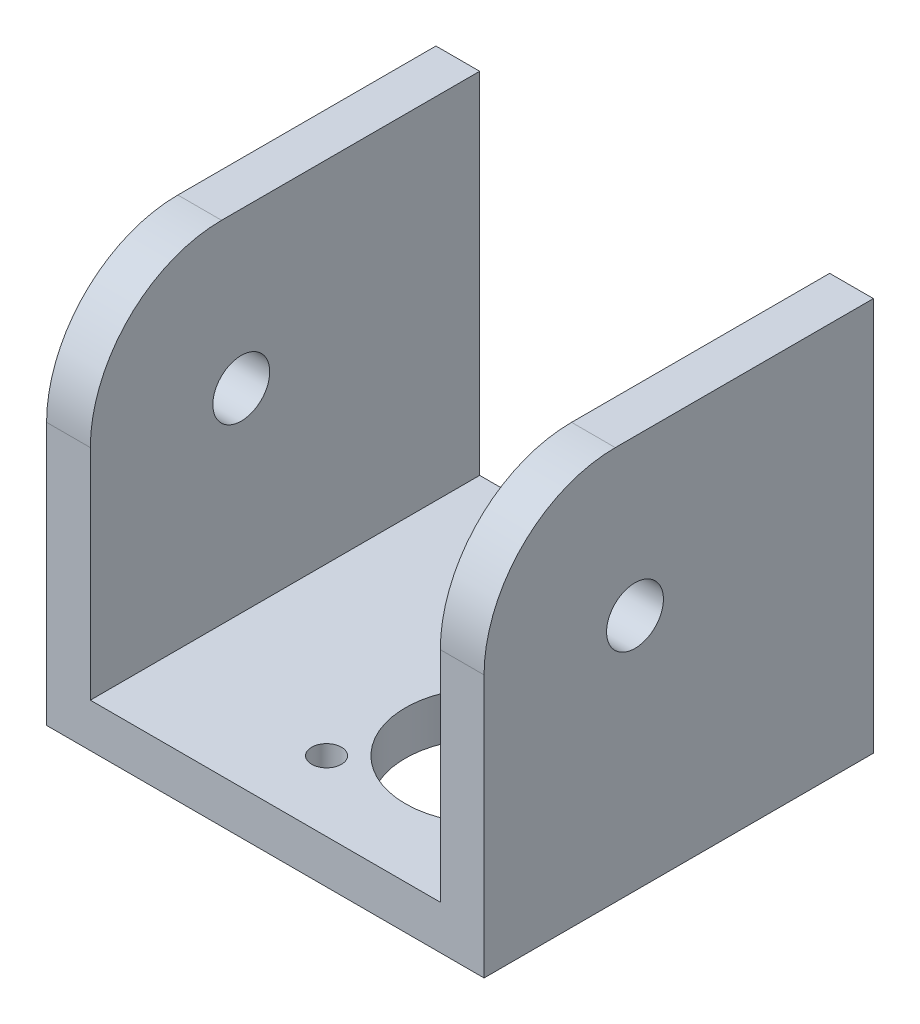
ISO-10303-21;
HEADER;
FILE_DESCRIPTION(('STEP AP214'),'2;1');
FILE_NAME('part.step','',(''),(''),'','','');
FILE_SCHEMA(('AUTOMOTIVE_DESIGN { 1 0 10303 214 1 1 1 1 }'));
ENDSEC;
DATA;
#1=APPLICATION_CONTEXT('core data for automotive mechanical design processes');
#2=APPLICATION_PROTOCOL_DEFINITION('international standard','automotive_design',2000,#1);
#3=PRODUCT_CONTEXT('',#1,'mechanical');
#4=PRODUCT('Part','Part','',(#3));
#5=PRODUCT_RELATED_PRODUCT_CATEGORY('part','',(#4));
#6=PRODUCT_DEFINITION_FORMATION('','',#4);
#7=PRODUCT_DEFINITION_CONTEXT('part definition',#1,'design');
#8=PRODUCT_DEFINITION('design','',#6,#7);
#9=PRODUCT_DEFINITION_SHAPE('','',#8);
#10=(LENGTH_UNIT() NAMED_UNIT(*) SI_UNIT(.MILLI.,.METRE.));
#11=(NAMED_UNIT(*) PLANE_ANGLE_UNIT() SI_UNIT($,.RADIAN.));
#12=(NAMED_UNIT(*) SI_UNIT($,.STERADIAN.) SOLID_ANGLE_UNIT());
#13=UNCERTAINTY_MEASURE_WITH_UNIT(LENGTH_MEASURE(1.E-05),#10,'distance_accuracy_value','');
#14=(GEOMETRIC_REPRESENTATION_CONTEXT(3) GLOBAL_UNCERTAINTY_ASSIGNED_CONTEXT((#13)) GLOBAL_UNIT_ASSIGNED_CONTEXT((#10,
#11,#12)) REPRESENTATION_CONTEXT('',''));
#15=CARTESIAN_POINT('',(0.,0.,0.));
#16=DIRECTION('',(0.,0.,1.));
#17=DIRECTION('',(1.,0.,0.));
#18=AXIS2_PLACEMENT_3D('',#15,#16,#17);
#19=CARTESIAN_POINT('',(5.,5.,-56.5685424949238));
#20=DIRECTION('',(0.,-1.,0.));
#21=DIRECTION('',(0.,0.,-1.));
#22=AXIS2_PLACEMENT_3D('',#19,#20,#21);
#23=PLANE('',#22);
#24=CARTESIAN_POINT('',(42.5,5.,18.));
#25=DIRECTION('',(0.,1.,0.));
#26=DIRECTION('',(0.,0.,1.));
#27=AXIS2_PLACEMENT_3D('',#24,#25,#26);
#28=CIRCLE('',#27,1.7);
#29=CARTESIAN_POINT('',(42.5,5.,19.7));
#30=VERTEX_POINT('',#29);
#31=EDGE_CURVE('E400',#30,#30,#28,.T.);
#32=ORIENTED_EDGE('',*,*,#31,.F.);
#33=EDGE_LOOP('',(#32));
#34=FACE_BOUND('',#33,.T.);
#35=CARTESIAN_POINT('',(24.,5.,18.));
#36=DIRECTION('',(0.,1.,0.));
#37=DIRECTION('',(0.,0.,1.));
#38=AXIS2_PLACEMENT_3D('',#35,#36,#37);
#39=CIRCLE('',#38,1.7);
#40=CARTESIAN_POINT('',(24.,5.,19.7));
#41=VERTEX_POINT('',#40);
#42=EDGE_CURVE('E412',#41,#41,#39,.T.);
#43=ORIENTED_EDGE('',*,*,#42,.F.);
#44=EDGE_LOOP('',(#43));
#45=FACE_BOUND('',#44,.T.);
#46=DIRECTION('',(0.,0.,1.));
#47=VECTOR('',#46,1.);
#48=CARTESIAN_POINT('',(5.,5.,-56.5685424949238));
#49=LINE('',#48,#47);
#50=CARTESIAN_POINT('',(5.,5.,0.));
#51=VERTEX_POINT('',#50);
#52=CARTESIAN_POINT('',(5.,5.,44.5));
#53=VERTEX_POINT('',#52);
#54=EDGE_CURVE('E144',#51,#53,#49,.T.);
#55=ORIENTED_EDGE('',*,*,#54,.T.);
#56=DIRECTION('',(1.,0.,0.));
#57=VECTOR('',#56,1.);
#58=CARTESIAN_POINT('',(5.,5.,44.5));
#59=LINE('',#58,#57);
#60=CARTESIAN_POINT('',(45.,5.,44.5));
#61=VERTEX_POINT('',#60);
#62=EDGE_CURVE('E131',#53,#61,#59,.T.);
#63=ORIENTED_EDGE('',*,*,#62,.T.);
#64=DIRECTION('',(0.,0.,1.));
#65=VECTOR('',#64,1.);
#66=CARTESIAN_POINT('',(45.,5.,-56.5685424949238));
#67=LINE('',#66,#65);
#68=CARTESIAN_POINT('',(45.,5.,0.));
#69=VERTEX_POINT('',#68);
#70=EDGE_CURVE('E116',#69,#61,#67,.T.);
#71=ORIENTED_EDGE('',*,*,#70,.F.);
#72=DIRECTION('',(1.,0.,0.));
#73=VECTOR('',#72,1.);
#74=CARTESIAN_POINT('',(5.,5.,0.));
#75=LINE('',#74,#73);
#76=EDGE_CURVE('E128',#51,#69,#75,.T.);
#77=ORIENTED_EDGE('',*,*,#76,.F.);
#78=EDGE_LOOP('',(#55,#63,#71,#77));
#79=FACE_BOUND('',#78,.T.);
#80=CARTESIAN_POINT('',(33.25,5.,27.25));
#81=DIRECTION('',(0.,1.,0.));
#82=DIRECTION('',(0.,0.,1.));
#83=AXIS2_PLACEMENT_3D('',#80,#81,#82);
#84=CIRCLE('',#83,9.5);
#85=CARTESIAN_POINT('',(33.25,5.,36.75));
#86=VERTEX_POINT('',#85);
#87=EDGE_CURVE('E430',#86,#86,#84,.T.);
#88=ORIENTED_EDGE('',*,*,#87,.F.);
#89=EDGE_LOOP('',(#88));
#90=FACE_BOUND('',#89,.T.);
#91=CARTESIAN_POINT('',(42.5,5.,36.5));
#92=DIRECTION('',(0.,1.,0.));
#93=DIRECTION('',(0.,0.,1.));
#94=AXIS2_PLACEMENT_3D('',#91,#92,#93);
#95=CIRCLE('',#94,1.7);
#96=CARTESIAN_POINT('',(42.5,5.,38.2));
#97=VERTEX_POINT('',#96);
#98=EDGE_CURVE('E424',#97,#97,#95,.T.);
#99=ORIENTED_EDGE('',*,*,#98,.F.);
#100=EDGE_LOOP('',(#99));
#101=FACE_BOUND('',#100,.T.);
#102=CARTESIAN_POINT('',(24.,5.,36.5));
#103=DIRECTION('',(0.,1.,0.));
#104=DIRECTION('',(0.,0.,1.));
#105=AXIS2_PLACEMENT_3D('',#102,#103,#104);
#106=CIRCLE('',#105,1.7);
#107=CARTESIAN_POINT('',(24.,5.,38.2));
#108=VERTEX_POINT('',#107);
#109=EDGE_CURVE('E418',#108,#108,#106,.T.);
#110=ORIENTED_EDGE('',*,*,#109,.F.);
#111=EDGE_LOOP('',(#110));
#112=FACE_BOUND('',#111,.T.);
#113=ADVANCED_FACE('F39',(#34,#45,#79,#90,#101,#112),#23,.F.);
#114=CARTESIAN_POINT('',(0.,45.,44.5));
#115=DIRECTION('',(0.,-1.,0.));
#116=DIRECTION('',(0.,0.,-1.));
#117=AXIS2_PLACEMENT_3D('',#114,#115,#116);
#118=PLANE('',#117);
#119=DIRECTION('',(0.,0.,1.));
#120=VECTOR('',#119,1.);
#121=CARTESIAN_POINT('',(45.,45.,-56.5685424949238));
#122=LINE('',#121,#120);
#123=CARTESIAN_POINT('',(45.,45.,0.));
#124=VERTEX_POINT('',#123);
#125=CARTESIAN_POINT('',(45.,45.,29.5));
#126=VERTEX_POINT('',#125);
#127=EDGE_CURVE('E118',#124,#126,#122,.T.);
#128=ORIENTED_EDGE('',*,*,#127,.T.);
#129=DIRECTION('',(-1.,0.,0.));
#130=VECTOR('',#129,1.);
#131=CARTESIAN_POINT('',(0.,45.,29.5));
#132=LINE('',#131,#130);
#133=CARTESIAN_POINT('',(50.,45.,29.5));
#134=VERTEX_POINT('',#133);
#135=EDGE_CURVE('E48',#126,#134,#132,.F.);
#136=ORIENTED_EDGE('',*,*,#135,.T.);
#137=DIRECTION('',(0.,0.,-1.));
#138=VECTOR('',#137,1.);
#139=CARTESIAN_POINT('',(50.,45.,44.5));
#140=LINE('',#139,#138);
#141=CARTESIAN_POINT('',(50.,45.,0.));
#142=VERTEX_POINT('',#141);
#143=EDGE_CURVE('E171',#134,#142,#140,.T.);
#144=ORIENTED_EDGE('',*,*,#143,.T.);
#145=DIRECTION('',(-1.,0.,0.));
#146=VECTOR('',#145,1.);
#147=CARTESIAN_POINT('',(0.,45.,0.));
#148=LINE('',#147,#146);
#149=EDGE_CURVE('E155',#142,#124,#148,.T.);
#150=ORIENTED_EDGE('',*,*,#149,.T.);
#151=EDGE_LOOP('',(#128,#136,#144,#150));
#152=FACE_BOUND('',#151,.T.);
#153=ADVANCED_FACE('F224',(#152),#118,.F.);
#154=CARTESIAN_POINT('',(0.,0.,44.5));
#155=DIRECTION('',(1.,0.,0.));
#156=DIRECTION('',(0.,0.,-1.));
#157=AXIS2_PLACEMENT_3D('',#154,#155,#156);
#158=PLANE('',#157);
#159=CARTESIAN_POINT('',(0.,27.25,27.25));
#160=DIRECTION('',(1.,0.,0.));
#161=DIRECTION('',(0.,0.,-1.));
#162=AXIS2_PLACEMENT_3D('',#159,#160,#161);
#163=CIRCLE('',#162,3.25);
#164=CARTESIAN_POINT('',(0.,27.25,24.));
#165=VERTEX_POINT('',#164);
#166=EDGE_CURVE('E406',#165,#165,#163,.F.);
#167=ORIENTED_EDGE('',*,*,#166,.F.);
#168=EDGE_LOOP('',(#167));
#169=FACE_BOUND('',#168,.T.);
#170=DIRECTION('',(0.,-1.,0.));
#171=VECTOR('',#170,1.);
#172=CARTESIAN_POINT('',(0.,0.,44.5));
#173=LINE('',#172,#171);
#174=CARTESIAN_POINT('',(0.,30.,44.5));
#175=VERTEX_POINT('',#174);
#176=CARTESIAN_POINT('',(0.,0.,44.5));
#177=VERTEX_POINT('',#176);
#178=EDGE_CURVE('E152',#175,#177,#173,.T.);
#179=ORIENTED_EDGE('',*,*,#178,.F.);
#180=CARTESIAN_POINT('',(0.,30.,29.5));
#181=DIRECTION('',(1.,0.,0.));
#182=DIRECTION('',(0.,0.,-1.));
#183=AXIS2_PLACEMENT_3D('',#180,#181,#182);
#184=CIRCLE('',#183,15.);
#185=CARTESIAN_POINT('',(0.,45.,29.5));
#186=VERTEX_POINT('',#185);
#187=EDGE_CURVE('E185',#175,#186,#184,.F.);
#188=ORIENTED_EDGE('',*,*,#187,.T.);
#189=DIRECTION('',(0.,0.,-1.));
#190=VECTOR('',#189,1.);
#191=CARTESIAN_POINT('',(0.,45.,44.5));
#192=LINE('',#191,#190);
#193=CARTESIAN_POINT('',(0.,45.,0.));
#194=VERTEX_POINT('',#193);
#195=EDGE_CURVE('E160',#186,#194,#192,.T.);
#196=ORIENTED_EDGE('',*,*,#195,.T.);
#197=DIRECTION('',(0.,-1.,0.));
#198=VECTOR('',#197,1.);
#199=CARTESIAN_POINT('',(0.,0.,0.));
#200=LINE('',#199,#198);
#201=CARTESIAN_POINT('',(0.,0.,0.));
#202=VERTEX_POINT('',#201);
#203=EDGE_CURVE('E151',#194,#202,#200,.T.);
#204=ORIENTED_EDGE('',*,*,#203,.T.);
#205=DIRECTION('',(0.,0.,-1.));
#206=VECTOR('',#205,1.);
#207=CARTESIAN_POINT('',(0.,0.,44.5));
#208=LINE('',#207,#206);
#209=EDGE_CURVE('E176',#177,#202,#208,.T.);
#210=ORIENTED_EDGE('',*,*,#209,.F.);
#211=EDGE_LOOP('',(#179,#188,#196,#204,#210));
#212=FACE_BOUND('',#211,.T.);
#213=ADVANCED_FACE('F207',(#169,#212),#158,.F.);
#214=CARTESIAN_POINT('',(0.,0.,44.5));
#215=DIRECTION('',(0.,1.,0.));
#216=DIRECTION('',(0.,0.,1.));
#217=AXIS2_PLACEMENT_3D('',#214,#215,#216);
#218=PLANE('',#217);
#219=CARTESIAN_POINT('',(42.5,0.,18.));
#220=DIRECTION('',(0.,1.,0.));
#221=DIRECTION('',(0.,0.,1.));
#222=AXIS2_PLACEMENT_3D('',#219,#220,#221);
#223=CIRCLE('',#222,1.7);
#224=CARTESIAN_POINT('',(42.5,0.,19.7));
#225=VERTEX_POINT('',#224);
#226=EDGE_CURVE('E403',#225,#225,#223,.T.);
#227=ORIENTED_EDGE('',*,*,#226,.T.);
#228=EDGE_LOOP('',(#227));
#229=FACE_BOUND('',#228,.T.);
#230=CARTESIAN_POINT('',(24.,0.,18.));
#231=DIRECTION('',(0.,1.,0.));
#232=DIRECTION('',(0.,0.,1.));
#233=AXIS2_PLACEMENT_3D('',#230,#231,#232);
#234=CIRCLE('',#233,1.7);
#235=CARTESIAN_POINT('',(24.,0.,19.7));
#236=VERTEX_POINT('',#235);
#237=EDGE_CURVE('E415',#236,#236,#234,.T.);
#238=ORIENTED_EDGE('',*,*,#237,.T.);
#239=EDGE_LOOP('',(#238));
#240=FACE_BOUND('',#239,.T.);
#241=CARTESIAN_POINT('',(24.,0.,36.5));
#242=DIRECTION('',(0.,1.,0.));
#243=DIRECTION('',(0.,0.,1.));
#244=AXIS2_PLACEMENT_3D('',#241,#242,#243);
#245=CIRCLE('',#244,1.7);
#246=CARTESIAN_POINT('',(24.,0.,38.2));
#247=VERTEX_POINT('',#246);
#248=EDGE_CURVE('E421',#247,#247,#245,.T.);
#249=ORIENTED_EDGE('',*,*,#248,.T.);
#250=EDGE_LOOP('',(#249));
#251=FACE_BOUND('',#250,.T.);
#252=CARTESIAN_POINT('',(42.5,0.,36.5));
#253=DIRECTION('',(0.,1.,0.));
#254=DIRECTION('',(0.,0.,1.));
#255=AXIS2_PLACEMENT_3D('',#252,#253,#254);
#256=CIRCLE('',#255,1.7);
#257=CARTESIAN_POINT('',(42.5,0.,38.2));
#258=VERTEX_POINT('',#257);
#259=EDGE_CURVE('E427',#258,#258,#256,.T.);
#260=ORIENTED_EDGE('',*,*,#259,.T.);
#261=EDGE_LOOP('',(#260));
#262=FACE_BOUND('',#261,.T.);
#263=CARTESIAN_POINT('',(33.25,0.,27.25));
#264=DIRECTION('',(0.,1.,0.));
#265=DIRECTION('',(0.,0.,1.));
#266=AXIS2_PLACEMENT_3D('',#263,#264,#265);
#267=CIRCLE('',#266,9.5);
#268=CARTESIAN_POINT('',(33.25,0.,36.75));
#269=VERTEX_POINT('',#268);
#270=EDGE_CURVE('E203',#269,#269,#267,.F.);
#271=ORIENTED_EDGE('',*,*,#270,.F.);
#272=EDGE_LOOP('',(#271));
#273=FACE_BOUND('',#272,.T.);
#274=DIRECTION('',(1.,0.,0.));
#275=VECTOR('',#274,1.);
#276=CARTESIAN_POINT('',(0.,0.,0.));
#277=LINE('',#276,#275);
#278=CARTESIAN_POINT('',(50.,0.,0.));
#279=VERTEX_POINT('',#278);
#280=EDGE_CURVE('E163',#202,#279,#277,.T.);
#281=ORIENTED_EDGE('',*,*,#280,.T.);
#282=DIRECTION('',(0.,0.,-1.));
#283=VECTOR('',#282,1.);
#284=CARTESIAN_POINT('',(50.,0.,44.5));
#285=LINE('',#284,#283);
#286=CARTESIAN_POINT('',(50.,0.,44.5));
#287=VERTEX_POINT('',#286);
#288=EDGE_CURVE('E173',#287,#279,#285,.T.);
#289=ORIENTED_EDGE('',*,*,#288,.F.);
#290=DIRECTION('',(1.,0.,0.));
#291=VECTOR('',#290,1.);
#292=CARTESIAN_POINT('',(0.,0.,44.5));
#293=LINE('',#292,#291);
#294=EDGE_CURVE('E154',#177,#287,#293,.T.);
#295=ORIENTED_EDGE('',*,*,#294,.F.);
#296=ORIENTED_EDGE('',*,*,#209,.T.);
#297=EDGE_LOOP('',(#281,#289,#295,#296));
#298=FACE_BOUND('',#297,.T.);
#299=ADVANCED_FACE('F216',(#229,#240,#251,#262,#273,#298),#218,.F.);
#300=CARTESIAN_POINT('',(50.,0.,44.5));
#301=DIRECTION('',(-1.,0.,0.));
#302=DIRECTION('',(0.,0.,1.));
#303=AXIS2_PLACEMENT_3D('',#300,#301,#302);
#304=PLANE('',#303);
#305=CARTESIAN_POINT('',(50.,27.25,27.25));
#306=DIRECTION('',(1.,0.,0.));
#307=DIRECTION('',(0.,0.,-1.));
#308=AXIS2_PLACEMENT_3D('',#305,#306,#307);
#309=CIRCLE('',#308,3.25);
#310=CARTESIAN_POINT('',(50.,27.25,24.));
#311=VERTEX_POINT('',#310);
#312=EDGE_CURVE('E396',#311,#311,#309,.T.);
#313=ORIENTED_EDGE('',*,*,#312,.F.);
#314=EDGE_LOOP('',(#313));
#315=FACE_BOUND('',#314,.T.);
#316=ORIENTED_EDGE('',*,*,#143,.F.);
#317=CARTESIAN_POINT('',(50.,30.,29.5));
#318=DIRECTION('',(-1.,0.,0.));
#319=DIRECTION('',(0.,0.,1.));
#320=AXIS2_PLACEMENT_3D('',#317,#318,#319);
#321=CIRCLE('',#320,15.);
#322=CARTESIAN_POINT('',(50.,30.,44.5));
#323=VERTEX_POINT('',#322);
#324=EDGE_CURVE('E11',#134,#323,#321,.F.);
#325=ORIENTED_EDGE('',*,*,#324,.T.);
#326=DIRECTION('',(0.,1.,0.));
#327=VECTOR('',#326,1.);
#328=CARTESIAN_POINT('',(50.,0.,44.5));
#329=LINE('',#328,#327);
#330=EDGE_CURVE('E157',#287,#323,#329,.T.);
#331=ORIENTED_EDGE('',*,*,#330,.F.);
#332=ORIENTED_EDGE('',*,*,#288,.T.);
#333=DIRECTION('',(0.,1.,0.));
#334=VECTOR('',#333,1.);
#335=CARTESIAN_POINT('',(50.,0.,0.));
#336=LINE('',#335,#334);
#337=EDGE_CURVE('E165',#279,#142,#336,.T.);
#338=ORIENTED_EDGE('',*,*,#337,.T.);
#339=EDGE_LOOP('',(#316,#325,#331,#332,#338));
#340=FACE_BOUND('',#339,.T.);
#341=ADVANCED_FACE('F223',(#315,#340),#304,.F.);
#342=ORIENTED_EDGE('',*,*,#195,.F.);
#343=DIRECTION('',(-1.,0.,0.));
#344=VECTOR('',#343,1.);
#345=CARTESIAN_POINT('',(0.,45.,29.5));
#346=LINE('',#345,#344);
#347=CARTESIAN_POINT('',(5.,45.,29.5));
#348=VERTEX_POINT('',#347);
#349=EDGE_CURVE('E187',#186,#348,#346,.F.);
#350=ORIENTED_EDGE('',*,*,#349,.T.);
#351=DIRECTION('',(0.,0.,1.));
#352=VECTOR('',#351,1.);
#353=CARTESIAN_POINT('',(5.,45.,-56.5685424949238));
#354=LINE('',#353,#352);
#355=CARTESIAN_POINT('',(5.,45.,0.));
#356=VERTEX_POINT('',#355);
#357=EDGE_CURVE('E145',#356,#348,#354,.T.);
#358=ORIENTED_EDGE('',*,*,#357,.F.);
#359=EDGE_CURVE('E168',#356,#194,#148,.T.);
#360=ORIENTED_EDGE('',*,*,#359,.T.);
#361=EDGE_LOOP('',(#342,#350,#358,#360));
#362=FACE_BOUND('',#361,.T.);
#363=ADVANCED_FACE('F211',(#362),#118,.F.);
#364=CARTESIAN_POINT('',(0.,0.,44.5));
#365=DIRECTION('',(0.,0.,-1.));
#366=DIRECTION('',(-1.,0.,0.));
#367=AXIS2_PLACEMENT_3D('',#364,#365,#366);
#368=PLANE('',#367);
#369=DIRECTION('',(0.,-1.,0.));
#370=VECTOR('',#369,1.);
#371=CARTESIAN_POINT('',(5.,45.,44.5));
#372=LINE('',#371,#370);
#373=CARTESIAN_POINT('',(5.,30.,44.5));
#374=VERTEX_POINT('',#373);
#375=EDGE_CURVE('E142',#374,#53,#372,.T.);
#376=ORIENTED_EDGE('',*,*,#375,.F.);
#377=DIRECTION('',(-1.,0.,0.));
#378=VECTOR('',#377,1.);
#379=CARTESIAN_POINT('',(0.,30.,44.5));
#380=LINE('',#379,#378);
#381=EDGE_CURVE('E182',#374,#175,#380,.T.);
#382=ORIENTED_EDGE('',*,*,#381,.T.);
#383=ORIENTED_EDGE('',*,*,#178,.T.);
#384=ORIENTED_EDGE('',*,*,#294,.T.);
#385=ORIENTED_EDGE('',*,*,#330,.T.);
#386=DIRECTION('',(-1.,0.,0.));
#387=VECTOR('',#386,1.);
#388=CARTESIAN_POINT('',(0.,30.,44.5));
#389=LINE('',#388,#387);
#390=CARTESIAN_POINT('',(45.,30.,44.5));
#391=VERTEX_POINT('',#390);
#392=EDGE_CURVE('E179',#323,#391,#389,.T.);
#393=ORIENTED_EDGE('',*,*,#392,.T.);
#394=DIRECTION('',(0.,1.,0.));
#395=VECTOR('',#394,1.);
#396=CARTESIAN_POINT('',(45.,5.,44.5));
#397=LINE('',#396,#395);
#398=EDGE_CURVE('E137',#61,#391,#397,.T.);
#399=ORIENTED_EDGE('',*,*,#398,.F.);
#400=ORIENTED_EDGE('',*,*,#62,.F.);
#401=EDGE_LOOP('',(#376,#382,#383,#384,#385,#393,#399,#400));
#402=FACE_BOUND('',#401,.T.);
#403=ADVANCED_FACE('F201',(#402),#368,.F.);
#404=CARTESIAN_POINT('',(0.,0.,0.));
#405=DIRECTION('',(0.,0.,-1.));
#406=DIRECTION('',(-1.,0.,0.));
#407=AXIS2_PLACEMENT_3D('',#404,#405,#406);
#408=PLANE('',#407);
#409=DIRECTION('',(0.,1.,0.));
#410=VECTOR('',#409,1.);
#411=CARTESIAN_POINT('',(45.,5.,0.));
#412=LINE('',#411,#410);
#413=EDGE_CURVE('E113',#69,#124,#412,.T.);
#414=ORIENTED_EDGE('',*,*,#413,.T.);
#415=ORIENTED_EDGE('',*,*,#149,.F.);
#416=ORIENTED_EDGE('',*,*,#337,.F.);
#417=ORIENTED_EDGE('',*,*,#280,.F.);
#418=ORIENTED_EDGE('',*,*,#203,.F.);
#419=ORIENTED_EDGE('',*,*,#359,.F.);
#420=DIRECTION('',(0.,-1.,0.));
#421=VECTOR('',#420,1.);
#422=CARTESIAN_POINT('',(5.,45.,0.));
#423=LINE('',#422,#421);
#424=EDGE_CURVE('E136',#356,#51,#423,.T.);
#425=ORIENTED_EDGE('',*,*,#424,.T.);
#426=ORIENTED_EDGE('',*,*,#76,.T.);
#427=EDGE_LOOP('',(#414,#415,#416,#417,#418,#419,#425,#426));
#428=FACE_BOUND('',#427,.T.);
#429=ADVANCED_FACE('F134',(#428),#408,.T.);
#430=CARTESIAN_POINT('',(45.,5.,-56.5685424949238));
#431=DIRECTION('',(1.,0.,0.));
#432=DIRECTION('',(0.,0.,-1.));
#433=AXIS2_PLACEMENT_3D('',#430,#431,#432);
#434=PLANE('',#433);
#435=CARTESIAN_POINT('',(45.,27.25,27.25));
#436=DIRECTION('',(1.,0.,0.));
#437=DIRECTION('',(0.,0.,-1.));
#438=AXIS2_PLACEMENT_3D('',#435,#436,#437);
#439=CIRCLE('',#438,3.25);
#440=CARTESIAN_POINT('',(45.,27.25,24.));
#441=VERTEX_POINT('',#440);
#442=EDGE_CURVE('E399',#441,#441,#439,.T.);
#443=ORIENTED_EDGE('',*,*,#442,.T.);
#444=EDGE_LOOP('',(#443));
#445=FACE_BOUND('',#444,.T.);
#446=ORIENTED_EDGE('',*,*,#398,.T.);
#447=CARTESIAN_POINT('',(45.,30.,29.5));
#448=DIRECTION('',(1.,0.,0.));
#449=DIRECTION('',(0.,0.,-1.));
#450=AXIS2_PLACEMENT_3D('',#447,#448,#449);
#451=CIRCLE('',#450,15.);
#452=EDGE_CURVE('E62',#391,#126,#451,.F.);
#453=ORIENTED_EDGE('',*,*,#452,.T.);
#454=ORIENTED_EDGE('',*,*,#127,.F.);
#455=ORIENTED_EDGE('',*,*,#413,.F.);
#456=ORIENTED_EDGE('',*,*,#70,.T.);
#457=EDGE_LOOP('',(#446,#453,#454,#455,#456));
#458=FACE_BOUND('',#457,.T.);
#459=ADVANCED_FACE('F115',(#445,#458),#434,.F.);
#460=CARTESIAN_POINT('',(5.,45.,-56.5685424949238));
#461=DIRECTION('',(-1.,0.,0.));
#462=DIRECTION('',(0.,-1.,0.));
#463=AXIS2_PLACEMENT_3D('',#460,#461,#462);
#464=PLANE('',#463);
#465=CARTESIAN_POINT('',(5.,27.25,27.25));
#466=DIRECTION('',(-1.,0.,0.));
#467=DIRECTION('',(0.,-1.,0.));
#468=AXIS2_PLACEMENT_3D('',#465,#466,#467);
#469=CIRCLE('',#468,3.25);
#470=CARTESIAN_POINT('',(5.,24.,27.25));
#471=VERTEX_POINT('',#470);
#472=EDGE_CURVE('E43',#471,#471,#469,.T.);
#473=ORIENTED_EDGE('',*,*,#472,.T.);
#474=EDGE_LOOP('',(#473));
#475=FACE_BOUND('',#474,.T.);
#476=ORIENTED_EDGE('',*,*,#357,.T.);
#477=CARTESIAN_POINT('',(5.,30.,29.5));
#478=DIRECTION('',(-1.,0.,0.));
#479=DIRECTION('',(0.,-1.,0.));
#480=AXIS2_PLACEMENT_3D('',#477,#478,#479);
#481=CIRCLE('',#480,15.);
#482=EDGE_CURVE('E189',#348,#374,#481,.F.);
#483=ORIENTED_EDGE('',*,*,#482,.T.);
#484=ORIENTED_EDGE('',*,*,#375,.T.);
#485=ORIENTED_EDGE('',*,*,#54,.F.);
#486=ORIENTED_EDGE('',*,*,#424,.F.);
#487=EDGE_LOOP('',(#476,#483,#484,#485,#486));
#488=FACE_BOUND('',#487,.T.);
#489=ADVANCED_FACE('F195',(#475,#488),#464,.F.);
#490=CARTESIAN_POINT('',(33.25,-26.8700576850888,27.25));
#491=DIRECTION('',(0.,1.,0.));
#492=DIRECTION('',(0.,0.,1.));
#493=AXIS2_PLACEMENT_3D('',#490,#491,#492);
#494=CYLINDRICAL_SURFACE('',#493,9.5);
#495=ORIENTED_EDGE('',*,*,#270,.T.);
#496=EDGE_LOOP('',(#495));
#497=FACE_BOUND('',#496,.T.);
#498=ORIENTED_EDGE('',*,*,#87,.T.);
#499=EDGE_LOOP('',(#498));
#500=FACE_BOUND('',#499,.T.);
#501=ADVANCED_FACE('F277',(#497,#500),#494,.F.);
#502=CARTESIAN_POINT('',(42.5,5.,36.5));
#503=DIRECTION('',(0.,1.,0.));
#504=DIRECTION('',(0.,0.,1.));
#505=AXIS2_PLACEMENT_3D('',#502,#503,#504);
#506=CYLINDRICAL_SURFACE('',#505,1.7);
#507=ORIENTED_EDGE('',*,*,#259,.F.);
#508=EDGE_LOOP('',(#507));
#509=FACE_BOUND('',#508,.T.);
#510=ORIENTED_EDGE('',*,*,#98,.T.);
#511=EDGE_LOOP('',(#510));
#512=FACE_BOUND('',#511,.T.);
#513=ADVANCED_FACE('F273',(#509,#512),#506,.F.);
#514=CARTESIAN_POINT('',(24.,5.,36.5));
#515=DIRECTION('',(0.,1.,0.));
#516=DIRECTION('',(0.,0.,1.));
#517=AXIS2_PLACEMENT_3D('',#514,#515,#516);
#518=CYLINDRICAL_SURFACE('',#517,1.7);
#519=ORIENTED_EDGE('',*,*,#248,.F.);
#520=EDGE_LOOP('',(#519));
#521=FACE_BOUND('',#520,.T.);
#522=ORIENTED_EDGE('',*,*,#109,.T.);
#523=EDGE_LOOP('',(#522));
#524=FACE_BOUND('',#523,.T.);
#525=ADVANCED_FACE('F263',(#521,#524),#518,.F.);
#526=CARTESIAN_POINT('',(24.,5.,18.));
#527=DIRECTION('',(0.,1.,0.));
#528=DIRECTION('',(0.,0.,1.));
#529=AXIS2_PLACEMENT_3D('',#526,#527,#528);
#530=CYLINDRICAL_SURFACE('',#529,1.7);
#531=ORIENTED_EDGE('',*,*,#237,.F.);
#532=EDGE_LOOP('',(#531));
#533=FACE_BOUND('',#532,.T.);
#534=ORIENTED_EDGE('',*,*,#42,.T.);
#535=EDGE_LOOP('',(#534));
#536=FACE_BOUND('',#535,.T.);
#537=ADVANCED_FACE('F257',(#533,#536),#530,.F.);
#538=CARTESIAN_POINT('',(42.5,5.,18.));
#539=DIRECTION('',(0.,1.,0.));
#540=DIRECTION('',(0.,0.,1.));
#541=AXIS2_PLACEMENT_3D('',#538,#539,#540);
#542=CYLINDRICAL_SURFACE('',#541,1.7);
#543=ORIENTED_EDGE('',*,*,#226,.F.);
#544=EDGE_LOOP('',(#543));
#545=FACE_BOUND('',#544,.T.);
#546=ORIENTED_EDGE('',*,*,#31,.T.);
#547=EDGE_LOOP('',(#546));
#548=FACE_BOUND('',#547,.T.);
#549=ADVANCED_FACE('F251',(#545,#548),#542,.F.);
#550=CARTESIAN_POINT('',(0.,30.,29.5));
#551=DIRECTION('',(-1.,0.,0.));
#552=DIRECTION('',(0.,0.,1.));
#553=AXIS2_PLACEMENT_3D('',#550,#551,#552);
#554=CYLINDRICAL_SURFACE('',#553,15.);
#555=ORIENTED_EDGE('',*,*,#482,.F.);
#556=ORIENTED_EDGE('',*,*,#349,.F.);
#557=ORIENTED_EDGE('',*,*,#187,.F.);
#558=ORIENTED_EDGE('',*,*,#381,.F.);
#559=EDGE_LOOP('',(#555,#556,#557,#558));
#560=FACE_BOUND('',#559,.T.);
#561=ADVANCED_FACE('F204',(#560),#554,.T.);
#562=CARTESIAN_POINT('',(0.,30.,29.5));
#563=DIRECTION('',(-1.,0.,0.));
#564=DIRECTION('',(0.,0.,1.));
#565=AXIS2_PLACEMENT_3D('',#562,#563,#564);
#566=CYLINDRICAL_SURFACE('',#565,15.);
#567=ORIENTED_EDGE('',*,*,#324,.F.);
#568=ORIENTED_EDGE('',*,*,#135,.F.);
#569=ORIENTED_EDGE('',*,*,#452,.F.);
#570=ORIENTED_EDGE('',*,*,#392,.F.);
#571=EDGE_LOOP('',(#567,#568,#569,#570));
#572=FACE_BOUND('',#571,.T.);
#573=ADVANCED_FACE('F41',(#572),#566,.T.);
#574=CARTESIAN_POINT('',(-9.19238815542511,27.25,27.25));
#575=DIRECTION('',(1.,0.,0.));
#576=DIRECTION('',(0.,0.,-1.));
#577=AXIS2_PLACEMENT_3D('',#574,#575,#576);
#578=CYLINDRICAL_SURFACE('',#577,3.25);
#579=ORIENTED_EDGE('',*,*,#166,.T.);
#580=EDGE_LOOP('',(#579));
#581=FACE_BOUND('',#580,.T.);
#582=ORIENTED_EDGE('',*,*,#472,.F.);
#583=EDGE_LOOP('',(#582));
#584=FACE_BOUND('',#583,.T.);
#585=ADVANCED_FACE('F256',(#581,#584),#578,.F.);
#586=ORIENTED_EDGE('',*,*,#312,.T.);
#587=EDGE_LOOP('',(#586));
#588=FACE_BOUND('',#587,.T.);
#589=ORIENTED_EDGE('',*,*,#442,.F.);
#590=EDGE_LOOP('',(#589));
#591=FACE_BOUND('',#590,.T.);
#592=ADVANCED_FACE('F269',(#588,#591),#578,.F.);
#593=CLOSED_SHELL('',(#113,#153,#213,#299,#341,#363,#403,#429,#459,#489,#501,#513,#525,#537,
#549,#561,#573,#585,#592));
#594=MANIFOLD_SOLID_BREP('B2',#593);
#595=ADVANCED_BREP_SHAPE_REPRESENTATION('',(#18,#594),#14);
#596=SHAPE_DEFINITION_REPRESENTATION(#9,#595);
ENDSEC;
END-ISO-10303-21;
